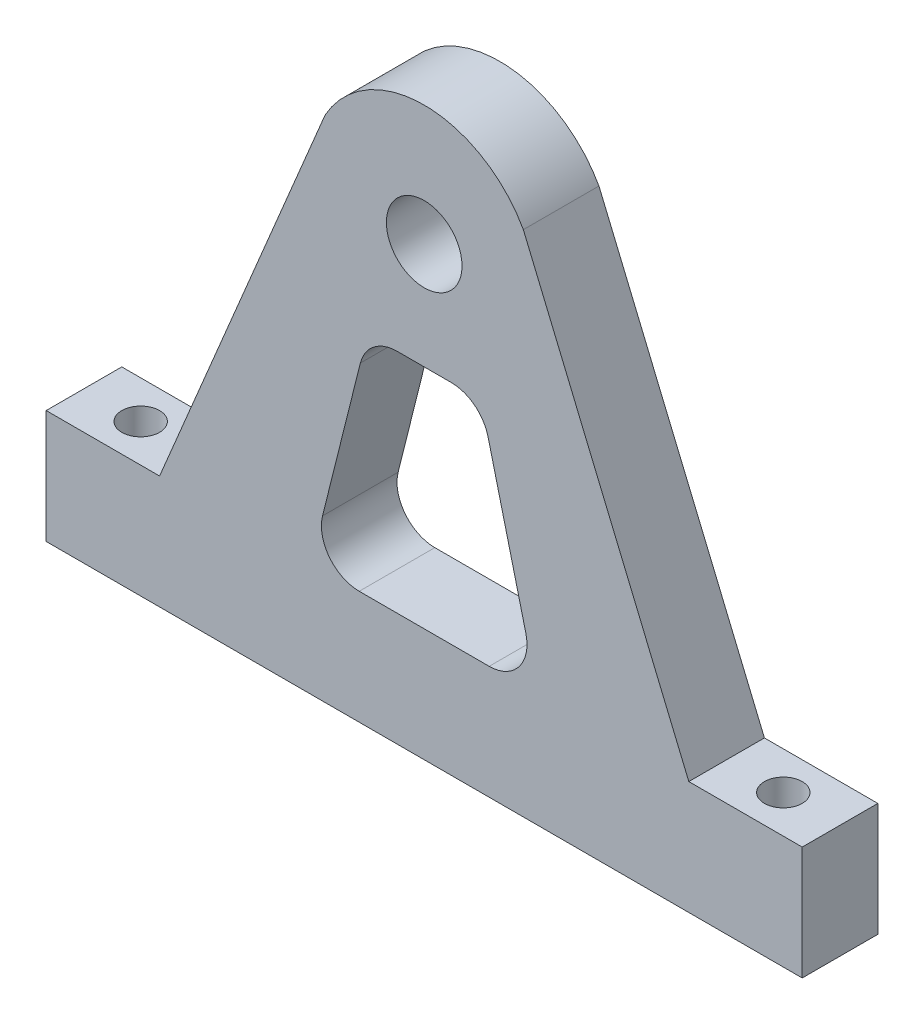
ISO-10303-21;
HEADER;
FILE_DESCRIPTION(('STEP AP214'),'2;1');
FILE_NAME('part.step','',(''),(''),'','','');
FILE_SCHEMA(('AUTOMOTIVE_DESIGN { 1 0 10303 214 1 1 1 1 }'));
ENDSEC;
DATA;
#1=APPLICATION_CONTEXT('core data for automotive mechanical design processes');
#2=APPLICATION_PROTOCOL_DEFINITION('international standard','automotive_design',2000,#1);
#3=PRODUCT_CONTEXT('',#1,'mechanical');
#4=PRODUCT('Part','Part','',(#3));
#5=PRODUCT_RELATED_PRODUCT_CATEGORY('part','',(#4));
#6=PRODUCT_DEFINITION_FORMATION('','',#4);
#7=PRODUCT_DEFINITION_CONTEXT('part definition',#1,'design');
#8=PRODUCT_DEFINITION('design','',#6,#7);
#9=PRODUCT_DEFINITION_SHAPE('','',#8);
#10=(LENGTH_UNIT() NAMED_UNIT(*) SI_UNIT(.MILLI.,.METRE.));
#11=(NAMED_UNIT(*) PLANE_ANGLE_UNIT() SI_UNIT($,.RADIAN.));
#12=(NAMED_UNIT(*) SI_UNIT($,.STERADIAN.) SOLID_ANGLE_UNIT());
#13=UNCERTAINTY_MEASURE_WITH_UNIT(LENGTH_MEASURE(1.E-05),#10,'distance_accuracy_value','');
#14=(GEOMETRIC_REPRESENTATION_CONTEXT(3) GLOBAL_UNCERTAINTY_ASSIGNED_CONTEXT((#13)) GLOBAL_UNIT_ASSIGNED_CONTEXT((#10,
#11,#12)) REPRESENTATION_CONTEXT('',''));
#15=CARTESIAN_POINT('',(0.,0.,0.));
#16=DIRECTION('',(0.,0.,1.));
#17=DIRECTION('',(1.,0.,0.));
#18=AXIS2_PLACEMENT_3D('',#15,#16,#17);
#19=CARTESIAN_POINT('',(0.,60.,10.));
#20=DIRECTION('',(0.,0.,1.));
#21=DIRECTION('',(1.,0.,0.));
#22=AXIS2_PLACEMENT_3D('',#19,#20,#21);
#23=PLANE('',#22);
#24=DIRECTION('',(1.,0.,0.));
#25=VECTOR('',#24,1.);
#26=CARTESIAN_POINT('',(0.,15.,10.));
#27=LINE('',#26,#25);
#28=CARTESIAN_POINT('',(-8.59611796797788,15.,10.));
#29=VERTEX_POINT('',#28);
#30=CARTESIAN_POINT('',(8.59611796797788,15.,10.));
#31=VERTEX_POINT('',#30);
#32=EDGE_CURVE('E212',#29,#31,#27,.T.);
#33=ORIENTED_EDGE('',*,*,#32,.F.);
#34=CARTESIAN_POINT('',(-8.59611796797792,20.,10.));
#35=DIRECTION('',(0.,0.,1.));
#36=DIRECTION('',(1.,0.,0.));
#37=AXIS2_PLACEMENT_3D('',#34,#35,#36);
#38=CIRCLE('',#37,5.);
#39=CARTESIAN_POINT('',(-13.4468304687046,21.2126781251817,10.));
#40=VERTEX_POINT('',#39);
#41=EDGE_CURVE('E189',#40,#29,#38,.T.);
#42=ORIENTED_EDGE('',*,*,#41,.F.);
#43=DIRECTION('',(-0.242535625036333,-0.970142500145332,0.));
#44=VECTOR('',#43,1.);
#45=CARTESIAN_POINT('',(-3.52941176470588,60.8823529411765,10.));
#46=LINE('',#45,#44);
#47=CARTESIAN_POINT('',(-8.44683046870459,41.2126781251816,10.));
#48=VERTEX_POINT('',#47);
#49=EDGE_CURVE('E154',#48,#40,#46,.T.);
#50=ORIENTED_EDGE('',*,*,#49,.F.);
#51=CARTESIAN_POINT('',(-3.59611796797792,40.,10.));
#52=DIRECTION('',(0.,0.,1.));
#53=DIRECTION('',(1.,0.,0.));
#54=AXIS2_PLACEMENT_3D('',#51,#52,#53);
#55=CIRCLE('',#54,5.);
#56=CARTESIAN_POINT('',(-3.5961179679779,45.,10.));
#57=VERTEX_POINT('',#56);
#58=EDGE_CURVE('E202',#57,#48,#55,.T.);
#59=ORIENTED_EDGE('',*,*,#58,.F.);
#60=DIRECTION('',(-1.,0.,0.));
#61=VECTOR('',#60,1.);
#62=CARTESIAN_POINT('',(0.,45.,10.));
#63=LINE('',#62,#61);
#64=CARTESIAN_POINT('',(3.5961179679779,45.,10.));
#65=VERTEX_POINT('',#64);
#66=EDGE_CURVE('E204',#65,#57,#63,.T.);
#67=ORIENTED_EDGE('',*,*,#66,.F.);
#68=CARTESIAN_POINT('',(3.59611796797792,40.,10.));
#69=DIRECTION('',(0.,0.,1.));
#70=DIRECTION('',(1.,0.,0.));
#71=AXIS2_PLACEMENT_3D('',#68,#69,#70);
#72=CIRCLE('',#71,5.);
#73=CARTESIAN_POINT('',(8.44683046870459,41.2126781251816,10.));
#74=VERTEX_POINT('',#73);
#75=EDGE_CURVE('E206',#74,#65,#72,.T.);
#76=ORIENTED_EDGE('',*,*,#75,.F.);
#77=DIRECTION('',(-0.242535625036333,0.970142500145332,0.));
#78=VECTOR('',#77,1.);
#79=CARTESIAN_POINT('',(3.52941176470588,60.8823529411765,10.));
#80=LINE('',#79,#78);
#81=CARTESIAN_POINT('',(13.4468304687046,21.2126781251817,10.));
#82=VERTEX_POINT('',#81);
#83=EDGE_CURVE('E208',#82,#74,#80,.T.);
#84=ORIENTED_EDGE('',*,*,#83,.F.);
#85=CARTESIAN_POINT('',(8.59611796797792,20.,10.));
#86=DIRECTION('',(0.,0.,1.));
#87=DIRECTION('',(1.,0.,0.));
#88=AXIS2_PLACEMENT_3D('',#85,#86,#87);
#89=CIRCLE('',#88,5.);
#90=EDGE_CURVE('E210',#31,#82,#89,.T.);
#91=ORIENTED_EDGE('',*,*,#90,.F.);
#92=EDGE_LOOP('',(#33,#42,#50,#59,#67,#76,#84,#91));
#93=FACE_BOUND('',#92,.T.);
#94=DIRECTION('',(-1.,0.,0.));
#95=VECTOR('',#94,1.);
#96=CARTESIAN_POINT('',(50.0000000000001,15.,10.));
#97=LINE('',#96,#95);
#98=CARTESIAN_POINT('',(50.0000000000001,15.,10.));
#99=VERTEX_POINT('',#98);
#100=CARTESIAN_POINT('',(35.0000000000001,15.,10.));
#101=VERTEX_POINT('',#100);
#102=EDGE_CURVE('E221',#99,#101,#97,.T.);
#103=ORIENTED_EDGE('',*,*,#102,.T.);
#104=DIRECTION('',(-0.386144072882083,0.922438483031815,0.));
#105=VECTOR('',#104,1.);
#106=CARTESIAN_POINT('',(35.0000000000001,15.,10.));
#107=LINE('',#106,#105);
#108=CARTESIAN_POINT('',(13.1149875109068,67.2799108915398,10.));
#109=VERTEX_POINT('',#108);
#110=EDGE_CURVE('E224',#101,#109,#107,.T.);
#111=ORIENTED_EDGE('',*,*,#110,.T.);
#112=CARTESIAN_POINT('',(0.,60.,10.));
#113=DIRECTION('',(0.,0.,1.));
#114=DIRECTION('',(1.,0.,0.));
#115=AXIS2_PLACEMENT_3D('',#112,#113,#114);
#116=CIRCLE('',#115,15.);
#117=CARTESIAN_POINT('',(-13.1149875109068,67.2799108915398,10.));
#118=VERTEX_POINT('',#117);
#119=EDGE_CURVE('E227',#109,#118,#116,.T.);
#120=ORIENTED_EDGE('',*,*,#119,.T.);
#121=DIRECTION('',(-0.386144072882083,-0.922438483031815,0.));
#122=VECTOR('',#121,1.);
#123=CARTESIAN_POINT('',(-35.0000000000001,15.,10.));
#124=LINE('',#123,#122);
#125=CARTESIAN_POINT('',(-35.0000000000001,15.,10.));
#126=VERTEX_POINT('',#125);
#127=EDGE_CURVE('E229',#118,#126,#124,.T.);
#128=ORIENTED_EDGE('',*,*,#127,.T.);
#129=DIRECTION('',(-1.,0.,0.));
#130=VECTOR('',#129,1.);
#131=CARTESIAN_POINT('',(-50.0000000000001,15.,10.));
#132=LINE('',#131,#130);
#133=CARTESIAN_POINT('',(-50.0000000000001,15.,10.));
#134=VERTEX_POINT('',#133);
#135=EDGE_CURVE('E231',#126,#134,#132,.T.);
#136=ORIENTED_EDGE('',*,*,#135,.T.);
#137=DIRECTION('',(0.,-1.,0.));
#138=VECTOR('',#137,1.);
#139=CARTESIAN_POINT('',(-50.0000000000001,0.,10.));
#140=LINE('',#139,#138);
#141=CARTESIAN_POINT('',(-50.0000000000001,0.,10.));
#142=VERTEX_POINT('',#141);
#143=EDGE_CURVE('E233',#134,#142,#140,.T.);
#144=ORIENTED_EDGE('',*,*,#143,.T.);
#145=DIRECTION('',(1.,0.,0.));
#146=VECTOR('',#145,1.);
#147=CARTESIAN_POINT('',(-35.,0.,10.));
#148=LINE('',#147,#146);
#149=CARTESIAN_POINT('',(50.0000000000001,0.,10.));
#150=VERTEX_POINT('',#149);
#151=EDGE_CURVE('E235',#142,#150,#148,.T.);
#152=ORIENTED_EDGE('',*,*,#151,.T.);
#153=DIRECTION('',(0.,1.,0.));
#154=VECTOR('',#153,1.);
#155=CARTESIAN_POINT('',(50.0000000000001,0.,10.));
#156=LINE('',#155,#154);
#157=EDGE_CURVE('E237',#150,#99,#156,.T.);
#158=ORIENTED_EDGE('',*,*,#157,.T.);
#159=EDGE_LOOP('',(#103,#111,#120,#128,#136,#144,#152,#158));
#160=FACE_BOUND('',#159,.T.);
#161=CARTESIAN_POINT('',(0.,59.06,10.));
#162=DIRECTION('',(0.,0.,1.));
#163=DIRECTION('',(1.,0.,0.));
#164=AXIS2_PLACEMENT_3D('',#161,#162,#163);
#165=CIRCLE('',#164,5.);
#166=CARTESIAN_POINT('',(5.,59.06,10.));
#167=VERTEX_POINT('',#166);
#168=EDGE_CURVE('E215',#167,#167,#165,.T.);
#169=ORIENTED_EDGE('',*,*,#168,.F.);
#170=EDGE_LOOP('',(#169));
#171=FACE_BOUND('',#170,.T.);
#172=ADVANCED_FACE('F33',(#93,#160,#171),#23,.T.);
#173=CARTESIAN_POINT('',(0.,60.,0.));
#174=DIRECTION('',(0.,0.,1.));
#175=DIRECTION('',(1.,0.,0.));
#176=AXIS2_PLACEMENT_3D('',#173,#174,#175);
#177=PLANE('',#176);
#178=CARTESIAN_POINT('',(-8.59611796797792,20.,0.));
#179=DIRECTION('',(0.,0.,-1.));
#180=DIRECTION('',(-1.,0.,0.));
#181=AXIS2_PLACEMENT_3D('',#178,#179,#180);
#182=CIRCLE('',#181,5.);
#183=CARTESIAN_POINT('',(-8.59611796797788,15.,0.));
#184=VERTEX_POINT('',#183);
#185=CARTESIAN_POINT('',(-13.4468304687046,21.2126781251817,0.));
#186=VERTEX_POINT('',#185);
#187=EDGE_CURVE('E160',#184,#186,#182,.T.);
#188=ORIENTED_EDGE('',*,*,#187,.F.);
#189=DIRECTION('',(-1.,0.,0.));
#190=VECTOR('',#189,1.);
#191=CARTESIAN_POINT('',(0.,15.,0.));
#192=LINE('',#191,#190);
#193=CARTESIAN_POINT('',(8.59611796797788,15.,0.));
#194=VERTEX_POINT('',#193);
#195=EDGE_CURVE('E58',#194,#184,#192,.T.);
#196=ORIENTED_EDGE('',*,*,#195,.F.);
#197=CARTESIAN_POINT('',(8.59611796797792,20.,0.));
#198=DIRECTION('',(0.,0.,-1.));
#199=DIRECTION('',(-1.,0.,0.));
#200=AXIS2_PLACEMENT_3D('',#197,#198,#199);
#201=CIRCLE('',#200,5.);
#202=CARTESIAN_POINT('',(13.4468304687046,21.2126781251817,0.));
#203=VERTEX_POINT('',#202);
#204=EDGE_CURVE('E183',#203,#194,#201,.T.);
#205=ORIENTED_EDGE('',*,*,#204,.F.);
#206=DIRECTION('',(0.242535625036333,-0.970142500145332,0.));
#207=VECTOR('',#206,1.);
#208=CARTESIAN_POINT('',(8.44683046870459,41.2126781251816,0.));
#209=LINE('',#208,#207);
#210=CARTESIAN_POINT('',(8.44683046870459,41.2126781251816,0.));
#211=VERTEX_POINT('',#210);
#212=EDGE_CURVE('E180',#211,#203,#209,.T.);
#213=ORIENTED_EDGE('',*,*,#212,.F.);
#214=CARTESIAN_POINT('',(3.59611796797792,40.,0.));
#215=DIRECTION('',(0.,0.,-1.));
#216=DIRECTION('',(-1.,0.,0.));
#217=AXIS2_PLACEMENT_3D('',#214,#215,#216);
#218=CIRCLE('',#217,5.);
#219=CARTESIAN_POINT('',(3.5961179679779,45.,0.));
#220=VERTEX_POINT('',#219);
#221=EDGE_CURVE('E177',#220,#211,#218,.T.);
#222=ORIENTED_EDGE('',*,*,#221,.F.);
#223=DIRECTION('',(1.,0.,0.));
#224=VECTOR('',#223,1.);
#225=CARTESIAN_POINT('',(0.,45.,0.));
#226=LINE('',#225,#224);
#227=CARTESIAN_POINT('',(-3.5961179679779,45.,0.));
#228=VERTEX_POINT('',#227);
#229=EDGE_CURVE('E171',#228,#220,#226,.T.);
#230=ORIENTED_EDGE('',*,*,#229,.F.);
#231=CARTESIAN_POINT('',(-3.59611796797792,40.,0.));
#232=DIRECTION('',(0.,0.,-1.));
#233=DIRECTION('',(-1.,0.,0.));
#234=AXIS2_PLACEMENT_3D('',#231,#232,#233);
#235=CIRCLE('',#234,5.);
#236=CARTESIAN_POINT('',(-8.44683046870459,41.2126781251816,0.));
#237=VERTEX_POINT('',#236);
#238=EDGE_CURVE('E169',#237,#228,#235,.T.);
#239=ORIENTED_EDGE('',*,*,#238,.F.);
#240=DIRECTION('',(0.242535625036333,0.970142500145332,0.));
#241=VECTOR('',#240,1.);
#242=CARTESIAN_POINT('',(-13.4468304687046,21.2126781251817,0.));
#243=LINE('',#242,#241);
#244=EDGE_CURVE('E151',#186,#237,#243,.T.);
#245=ORIENTED_EDGE('',*,*,#244,.F.);
#246=EDGE_LOOP('',(#188,#196,#205,#213,#222,#230,#239,#245));
#247=FACE_BOUND('',#246,.T.);
#248=DIRECTION('',(-1.,0.,0.));
#249=VECTOR('',#248,1.);
#250=CARTESIAN_POINT('',(50.0000000000001,15.,0.));
#251=LINE('',#250,#249);
#252=CARTESIAN_POINT('',(50.0000000000001,15.,0.));
#253=VERTEX_POINT('',#252);
#254=CARTESIAN_POINT('',(35.0000000000001,15.,0.));
#255=VERTEX_POINT('',#254);
#256=EDGE_CURVE('E218',#253,#255,#251,.T.);
#257=ORIENTED_EDGE('',*,*,#256,.F.);
#258=DIRECTION('',(0.,1.,0.));
#259=VECTOR('',#258,1.);
#260=CARTESIAN_POINT('',(50.0000000000001,0.,0.));
#261=LINE('',#260,#259);
#262=CARTESIAN_POINT('',(50.0000000000001,0.,0.));
#263=VERTEX_POINT('',#262);
#264=EDGE_CURVE('E225',#263,#253,#261,.T.);
#265=ORIENTED_EDGE('',*,*,#264,.F.);
#266=DIRECTION('',(1.,0.,0.));
#267=VECTOR('',#266,1.);
#268=CARTESIAN_POINT('',(35.,0.,0.));
#269=LINE('',#268,#267);
#270=CARTESIAN_POINT('',(-50.0000000000001,0.,0.));
#271=VERTEX_POINT('',#270);
#272=EDGE_CURVE('E253',#271,#263,#269,.T.);
#273=ORIENTED_EDGE('',*,*,#272,.F.);
#274=DIRECTION('',(0.,-1.,0.));
#275=VECTOR('',#274,1.);
#276=CARTESIAN_POINT('',(-50.0000000000001,0.,0.));
#277=LINE('',#276,#275);
#278=CARTESIAN_POINT('',(-50.0000000000001,15.,0.));
#279=VERTEX_POINT('',#278);
#280=EDGE_CURVE('E250',#279,#271,#277,.T.);
#281=ORIENTED_EDGE('',*,*,#280,.F.);
#282=DIRECTION('',(-1.,0.,0.));
#283=VECTOR('',#282,1.);
#284=CARTESIAN_POINT('',(-50.0000000000001,15.,0.));
#285=LINE('',#284,#283);
#286=CARTESIAN_POINT('',(-35.0000000000001,15.,0.));
#287=VERTEX_POINT('',#286);
#288=EDGE_CURVE('E248',#287,#279,#285,.T.);
#289=ORIENTED_EDGE('',*,*,#288,.F.);
#290=DIRECTION('',(-0.386144072882083,-0.922438483031815,0.));
#291=VECTOR('',#290,1.);
#292=CARTESIAN_POINT('',(-35.0000000000001,15.,0.));
#293=LINE('',#292,#291);
#294=CARTESIAN_POINT('',(-13.1149875109068,67.2799108915398,0.));
#295=VERTEX_POINT('',#294);
#296=EDGE_CURVE('E246',#295,#287,#293,.T.);
#297=ORIENTED_EDGE('',*,*,#296,.F.);
#298=CARTESIAN_POINT('',(0.,60.,0.));
#299=DIRECTION('',(0.,0.,1.));
#300=DIRECTION('',(1.,0.,0.));
#301=AXIS2_PLACEMENT_3D('',#298,#299,#300);
#302=CIRCLE('',#301,15.);
#303=CARTESIAN_POINT('',(13.1149875109068,67.2799108915398,0.));
#304=VERTEX_POINT('',#303);
#305=EDGE_CURVE('E244',#304,#295,#302,.T.);
#306=ORIENTED_EDGE('',*,*,#305,.F.);
#307=DIRECTION('',(-0.386144072882083,0.922438483031815,0.));
#308=VECTOR('',#307,1.);
#309=CARTESIAN_POINT('',(35.0000000000001,15.,0.));
#310=LINE('',#309,#308);
#311=EDGE_CURVE('E242',#255,#304,#310,.T.);
#312=ORIENTED_EDGE('',*,*,#311,.F.);
#313=EDGE_LOOP('',(#257,#265,#273,#281,#289,#297,#306,#312));
#314=FACE_BOUND('',#313,.T.);
#315=CARTESIAN_POINT('',(0.,59.06,0.));
#316=DIRECTION('',(0.,0.,1.));
#317=DIRECTION('',(1.,0.,0.));
#318=AXIS2_PLACEMENT_3D('',#315,#316,#317);
#319=CIRCLE('',#318,5.);
#320=CARTESIAN_POINT('',(5.,59.06,0.));
#321=VERTEX_POINT('',#320);
#322=EDGE_CURVE('E214',#321,#321,#319,.T.);
#323=ORIENTED_EDGE('',*,*,#322,.T.);
#324=EDGE_LOOP('',(#323));
#325=FACE_BOUND('',#324,.T.);
#326=ADVANCED_FACE('F165',(#247,#314,#325),#177,.F.);
#327=CARTESIAN_POINT('',(50.0000000000001,15.,10.));
#328=DIRECTION('',(0.,-1.,0.));
#329=DIRECTION('',(0.,0.,-1.));
#330=AXIS2_PLACEMENT_3D('',#327,#328,#329);
#331=PLANE('',#330);
#332=CARTESIAN_POINT('',(42.5000000000001,15.,5.));
#333=DIRECTION('',(0.,1.,0.));
#334=DIRECTION('',(0.,0.,-1.));
#335=AXIS2_PLACEMENT_3D('',#332,#333,#334);
#336=CIRCLE('',#335,2.5);
#337=CARTESIAN_POINT('',(42.5000000000001,15.,2.5));
#338=VERTEX_POINT('',#337);
#339=EDGE_CURVE('E282',#338,#338,#336,.T.);
#340=ORIENTED_EDGE('',*,*,#339,.F.);
#341=EDGE_LOOP('',(#340));
#342=FACE_BOUND('',#341,.T.);
#343=ORIENTED_EDGE('',*,*,#256,.T.);
#344=DIRECTION('',(0.,0.,-1.));
#345=VECTOR('',#344,1.);
#346=CARTESIAN_POINT('',(35.0000000000001,15.,10.));
#347=LINE('',#346,#345);
#348=EDGE_CURVE('E11',#101,#255,#347,.T.);
#349=ORIENTED_EDGE('',*,*,#348,.F.);
#350=ORIENTED_EDGE('',*,*,#102,.F.);
#351=DIRECTION('',(0.,0.,-1.));
#352=VECTOR('',#351,1.);
#353=CARTESIAN_POINT('',(50.0000000000001,15.,10.));
#354=LINE('',#353,#352);
#355=EDGE_CURVE('E239',#99,#253,#354,.T.);
#356=ORIENTED_EDGE('',*,*,#355,.T.);
#357=EDGE_LOOP('',(#343,#349,#350,#356));
#358=FACE_BOUND('',#357,.T.);
#359=ADVANCED_FACE('F35',(#342,#358),#331,.F.);
#360=CARTESIAN_POINT('',(35.0000000000001,15.,10.));
#361=DIRECTION('',(-0.922438483031815,-0.386144072882083,0.));
#362=DIRECTION('',(0.386144072882083,-0.922438483031815,0.));
#363=AXIS2_PLACEMENT_3D('',#360,#361,#362);
#364=PLANE('',#363);
#365=ORIENTED_EDGE('',*,*,#311,.T.);
#366=DIRECTION('',(0.,0.,-1.));
#367=VECTOR('',#366,1.);
#368=CARTESIAN_POINT('',(13.1149875109068,67.2799108915398,10.));
#369=LINE('',#368,#367);
#370=EDGE_CURVE('E42',#109,#304,#369,.T.);
#371=ORIENTED_EDGE('',*,*,#370,.F.);
#372=ORIENTED_EDGE('',*,*,#110,.F.);
#373=ORIENTED_EDGE('',*,*,#348,.T.);
#374=EDGE_LOOP('',(#365,#371,#372,#373));
#375=FACE_BOUND('',#374,.T.);
#376=ADVANCED_FACE('F292',(#375),#364,.F.);
#377=CARTESIAN_POINT('',(0.,60.,10.));
#378=DIRECTION('',(0.,0.,-1.));
#379=DIRECTION('',(-1.,0.,0.));
#380=AXIS2_PLACEMENT_3D('',#377,#378,#379);
#381=CYLINDRICAL_SURFACE('',#380,15.);
#382=ORIENTED_EDGE('',*,*,#305,.T.);
#383=DIRECTION('',(0.,0.,-1.));
#384=VECTOR('',#383,1.);
#385=CARTESIAN_POINT('',(-13.1149875109068,67.2799108915398,10.));
#386=LINE('',#385,#384);
#387=EDGE_CURVE('E270',#118,#295,#386,.T.);
#388=ORIENTED_EDGE('',*,*,#387,.F.);
#389=ORIENTED_EDGE('',*,*,#119,.F.);
#390=ORIENTED_EDGE('',*,*,#370,.T.);
#391=EDGE_LOOP('',(#382,#388,#389,#390));
#392=FACE_BOUND('',#391,.T.);
#393=ADVANCED_FACE('F329',(#392),#381,.T.);
#394=CARTESIAN_POINT('',(-35.0000000000001,15.,10.));
#395=DIRECTION('',(0.922438483031815,-0.386144072882083,0.));
#396=DIRECTION('',(0.386144072882083,0.922438483031815,0.));
#397=AXIS2_PLACEMENT_3D('',#394,#395,#396);
#398=PLANE('',#397);
#399=ORIENTED_EDGE('',*,*,#296,.T.);
#400=DIRECTION('',(0.,0.,-1.));
#401=VECTOR('',#400,1.);
#402=CARTESIAN_POINT('',(-35.0000000000001,15.,10.));
#403=LINE('',#402,#401);
#404=EDGE_CURVE('E267',#126,#287,#403,.T.);
#405=ORIENTED_EDGE('',*,*,#404,.F.);
#406=ORIENTED_EDGE('',*,*,#127,.F.);
#407=ORIENTED_EDGE('',*,*,#387,.T.);
#408=EDGE_LOOP('',(#399,#405,#406,#407));
#409=FACE_BOUND('',#408,.T.);
#410=ADVANCED_FACE('F325',(#409),#398,.F.);
#411=CARTESIAN_POINT('',(-50.0000000000001,15.,10.));
#412=DIRECTION('',(0.,-1.,0.));
#413=DIRECTION('',(0.,0.,-1.));
#414=AXIS2_PLACEMENT_3D('',#411,#412,#413);
#415=PLANE('',#414);
#416=CARTESIAN_POINT('',(-42.5000000000001,15.,5.));
#417=DIRECTION('',(0.,1.,0.));
#418=DIRECTION('',(0.,0.,1.));
#419=AXIS2_PLACEMENT_3D('',#416,#417,#418);
#420=CIRCLE('',#419,2.5);
#421=CARTESIAN_POINT('',(-42.5000000000001,15.,7.5));
#422=VERTEX_POINT('',#421);
#423=EDGE_CURVE('E275',#422,#422,#420,.T.);
#424=ORIENTED_EDGE('',*,*,#423,.F.);
#425=EDGE_LOOP('',(#424));
#426=FACE_BOUND('',#425,.T.);
#427=ORIENTED_EDGE('',*,*,#288,.T.);
#428=DIRECTION('',(0.,0.,-1.));
#429=VECTOR('',#428,1.);
#430=CARTESIAN_POINT('',(-50.0000000000001,15.,10.));
#431=LINE('',#430,#429);
#432=EDGE_CURVE('E264',#134,#279,#431,.T.);
#433=ORIENTED_EDGE('',*,*,#432,.F.);
#434=ORIENTED_EDGE('',*,*,#135,.F.);
#435=ORIENTED_EDGE('',*,*,#404,.T.);
#436=EDGE_LOOP('',(#427,#433,#434,#435));
#437=FACE_BOUND('',#436,.T.);
#438=ADVANCED_FACE('F322',(#426,#437),#415,.F.);
#439=CARTESIAN_POINT('',(-50.0000000000001,0.,10.));
#440=DIRECTION('',(1.,0.,0.));
#441=DIRECTION('',(0.,0.,-1.));
#442=AXIS2_PLACEMENT_3D('',#439,#440,#441);
#443=PLANE('',#442);
#444=ORIENTED_EDGE('',*,*,#280,.T.);
#445=DIRECTION('',(0.,0.,-1.));
#446=VECTOR('',#445,1.);
#447=CARTESIAN_POINT('',(-50.0000000000001,0.,10.));
#448=LINE('',#447,#446);
#449=EDGE_CURVE('E261',#142,#271,#448,.T.);
#450=ORIENTED_EDGE('',*,*,#449,.F.);
#451=ORIENTED_EDGE('',*,*,#143,.F.);
#452=ORIENTED_EDGE('',*,*,#432,.T.);
#453=EDGE_LOOP('',(#444,#450,#451,#452));
#454=FACE_BOUND('',#453,.T.);
#455=ADVANCED_FACE('F317',(#454),#443,.F.);
#456=CARTESIAN_POINT('',(35.,0.,10.));
#457=DIRECTION('',(0.,1.,0.));
#458=DIRECTION('',(-1.,0.,0.));
#459=AXIS2_PLACEMENT_3D('',#456,#457,#458);
#460=PLANE('',#459);
#461=CARTESIAN_POINT('',(42.5000000000001,0.,5.));
#462=DIRECTION('',(0.,1.,0.));
#463=DIRECTION('',(-1.,0.,0.));
#464=AXIS2_PLACEMENT_3D('',#461,#462,#463);
#465=CIRCLE('',#464,2.5);
#466=CARTESIAN_POINT('',(40.0000000000001,0.,5.));
#467=VERTEX_POINT('',#466);
#468=EDGE_CURVE('E37',#467,#467,#465,.T.);
#469=ORIENTED_EDGE('',*,*,#468,.T.);
#470=EDGE_LOOP('',(#469));
#471=FACE_BOUND('',#470,.T.);
#472=CARTESIAN_POINT('',(-42.5000000000001,0.,5.));
#473=DIRECTION('',(0.,1.,0.));
#474=DIRECTION('',(-1.,0.,0.));
#475=AXIS2_PLACEMENT_3D('',#472,#473,#474);
#476=CIRCLE('',#475,2.5);
#477=CARTESIAN_POINT('',(-45.0000000000001,0.,5.));
#478=VERTEX_POINT('',#477);
#479=EDGE_CURVE('E163',#478,#478,#476,.T.);
#480=ORIENTED_EDGE('',*,*,#479,.T.);
#481=EDGE_LOOP('',(#480));
#482=FACE_BOUND('',#481,.T.);
#483=ORIENTED_EDGE('',*,*,#272,.T.);
#484=DIRECTION('',(0.,0.,-1.));
#485=VECTOR('',#484,1.);
#486=CARTESIAN_POINT('',(50.0000000000001,0.,10.));
#487=LINE('',#486,#485);
#488=EDGE_CURVE('E258',#150,#263,#487,.T.);
#489=ORIENTED_EDGE('',*,*,#488,.F.);
#490=ORIENTED_EDGE('',*,*,#151,.F.);
#491=ORIENTED_EDGE('',*,*,#449,.T.);
#492=EDGE_LOOP('',(#483,#489,#490,#491));
#493=FACE_BOUND('',#492,.T.);
#494=ADVANCED_FACE('F312',(#471,#482,#493),#460,.F.);
#495=CARTESIAN_POINT('',(50.0000000000001,0.,10.));
#496=DIRECTION('',(-1.,0.,0.));
#497=DIRECTION('',(0.,0.,1.));
#498=AXIS2_PLACEMENT_3D('',#495,#496,#497);
#499=PLANE('',#498);
#500=ORIENTED_EDGE('',*,*,#264,.T.);
#501=ORIENTED_EDGE('',*,*,#355,.F.);
#502=ORIENTED_EDGE('',*,*,#157,.F.);
#503=ORIENTED_EDGE('',*,*,#488,.T.);
#504=EDGE_LOOP('',(#500,#501,#502,#503));
#505=FACE_BOUND('',#504,.T.);
#506=ADVANCED_FACE('F310',(#505),#499,.F.);
#507=CARTESIAN_POINT('',(0.,59.06,10.));
#508=DIRECTION('',(0.,0.,-1.));
#509=DIRECTION('',(-1.,0.,0.));
#510=AXIS2_PLACEMENT_3D('',#507,#508,#509);
#511=CYLINDRICAL_SURFACE('',#510,5.);
#512=ORIENTED_EDGE('',*,*,#168,.T.);
#513=EDGE_LOOP('',(#512));
#514=FACE_BOUND('',#513,.T.);
#515=ORIENTED_EDGE('',*,*,#322,.F.);
#516=EDGE_LOOP('',(#515));
#517=FACE_BOUND('',#516,.T.);
#518=ADVANCED_FACE('F346',(#514,#517),#511,.F.);
#519=CARTESIAN_POINT('',(0.,15.,25.));
#520=DIRECTION('',(0.,-1.,0.));
#521=DIRECTION('',(1.,0.,0.));
#522=AXIS2_PLACEMENT_3D('',#519,#520,#521);
#523=PLANE('',#522);
#524=ORIENTED_EDGE('',*,*,#32,.T.);
#525=DIRECTION('',(0.,0.,-1.));
#526=VECTOR('',#525,1.);
#527=CARTESIAN_POINT('',(8.59611796797788,15.,25.));
#528=LINE('',#527,#526);
#529=EDGE_CURVE('E187',#31,#194,#528,.T.);
#530=ORIENTED_EDGE('',*,*,#529,.T.);
#531=ORIENTED_EDGE('',*,*,#195,.T.);
#532=DIRECTION('',(0.,0.,-1.));
#533=VECTOR('',#532,1.);
#534=CARTESIAN_POINT('',(-8.59611796797788,15.,25.));
#535=LINE('',#534,#533);
#536=EDGE_CURVE('E157',#29,#184,#535,.T.);
#537=ORIENTED_EDGE('',*,*,#536,.F.);
#538=EDGE_LOOP('',(#524,#530,#531,#537));
#539=FACE_BOUND('',#538,.T.);
#540=ADVANCED_FACE('F389',(#539),#523,.F.);
#541=CARTESIAN_POINT('',(8.59611796797792,20.,25.));
#542=DIRECTION('',(0.,0.,-1.));
#543=DIRECTION('',(-1.,0.,0.));
#544=AXIS2_PLACEMENT_3D('',#541,#542,#543);
#545=CYLINDRICAL_SURFACE('',#544,5.);
#546=ORIENTED_EDGE('',*,*,#90,.T.);
#547=DIRECTION('',(0.,0.,-1.));
#548=VECTOR('',#547,1.);
#549=CARTESIAN_POINT('',(13.4468304687046,21.2126781251817,25.));
#550=LINE('',#549,#548);
#551=EDGE_CURVE('E190',#82,#203,#550,.T.);
#552=ORIENTED_EDGE('',*,*,#551,.T.);
#553=ORIENTED_EDGE('',*,*,#204,.T.);
#554=ORIENTED_EDGE('',*,*,#529,.F.);
#555=EDGE_LOOP('',(#546,#552,#553,#554));
#556=FACE_BOUND('',#555,.T.);
#557=ADVANCED_FACE('F392',(#556),#545,.F.);
#558=CARTESIAN_POINT('',(8.44683046870459,41.2126781251816,25.));
#559=DIRECTION('',(0.970142500145332,0.242535625036333,0.));
#560=DIRECTION('',(-0.242535625036333,0.970142500145332,0.));
#561=AXIS2_PLACEMENT_3D('',#558,#559,#560);
#562=PLANE('',#561);
#563=ORIENTED_EDGE('',*,*,#83,.T.);
#564=DIRECTION('',(0.,0.,-1.));
#565=VECTOR('',#564,1.);
#566=CARTESIAN_POINT('',(8.44683046870459,41.2126781251816,25.));
#567=LINE('',#566,#565);
#568=EDGE_CURVE('E192',#74,#211,#567,.T.);
#569=ORIENTED_EDGE('',*,*,#568,.T.);
#570=ORIENTED_EDGE('',*,*,#212,.T.);
#571=ORIENTED_EDGE('',*,*,#551,.F.);
#572=EDGE_LOOP('',(#563,#569,#570,#571));
#573=FACE_BOUND('',#572,.T.);
#574=ADVANCED_FACE('F395',(#573),#562,.F.);
#575=CARTESIAN_POINT('',(3.59611796797792,40.,25.));
#576=DIRECTION('',(0.,0.,-1.));
#577=DIRECTION('',(-1.,0.,0.));
#578=AXIS2_PLACEMENT_3D('',#575,#576,#577);
#579=CYLINDRICAL_SURFACE('',#578,5.);
#580=ORIENTED_EDGE('',*,*,#75,.T.);
#581=DIRECTION('',(0.,0.,-1.));
#582=VECTOR('',#581,1.);
#583=CARTESIAN_POINT('',(3.5961179679779,45.,25.));
#584=LINE('',#583,#582);
#585=EDGE_CURVE('E194',#65,#220,#584,.T.);
#586=ORIENTED_EDGE('',*,*,#585,.T.);
#587=ORIENTED_EDGE('',*,*,#221,.T.);
#588=ORIENTED_EDGE('',*,*,#568,.F.);
#589=EDGE_LOOP('',(#580,#586,#587,#588));
#590=FACE_BOUND('',#589,.T.);
#591=ADVANCED_FACE('F399',(#590),#579,.F.);
#592=CARTESIAN_POINT('',(0.,45.,25.));
#593=DIRECTION('',(0.,1.,0.));
#594=DIRECTION('',(0.,0.,1.));
#595=AXIS2_PLACEMENT_3D('',#592,#593,#594);
#596=PLANE('',#595);
#597=ORIENTED_EDGE('',*,*,#66,.T.);
#598=DIRECTION('',(0.,0.,-1.));
#599=VECTOR('',#598,1.);
#600=CARTESIAN_POINT('',(-3.5961179679779,45.,25.));
#601=LINE('',#600,#599);
#602=EDGE_CURVE('E196',#57,#228,#601,.T.);
#603=ORIENTED_EDGE('',*,*,#602,.T.);
#604=ORIENTED_EDGE('',*,*,#229,.T.);
#605=ORIENTED_EDGE('',*,*,#585,.F.);
#606=EDGE_LOOP('',(#597,#603,#604,#605));
#607=FACE_BOUND('',#606,.T.);
#608=ADVANCED_FACE('F403',(#607),#596,.F.);
#609=CARTESIAN_POINT('',(-3.59611796797792,40.,25.));
#610=DIRECTION('',(0.,0.,-1.));
#611=DIRECTION('',(-1.,0.,0.));
#612=AXIS2_PLACEMENT_3D('',#609,#610,#611);
#613=CYLINDRICAL_SURFACE('',#612,5.);
#614=ORIENTED_EDGE('',*,*,#58,.T.);
#615=DIRECTION('',(0.,0.,-1.));
#616=VECTOR('',#615,1.);
#617=CARTESIAN_POINT('',(-8.44683046870459,41.2126781251816,25.));
#618=LINE('',#617,#616);
#619=EDGE_CURVE('E156',#48,#237,#618,.T.);
#620=ORIENTED_EDGE('',*,*,#619,.T.);
#621=ORIENTED_EDGE('',*,*,#238,.T.);
#622=ORIENTED_EDGE('',*,*,#602,.F.);
#623=EDGE_LOOP('',(#614,#620,#621,#622));
#624=FACE_BOUND('',#623,.T.);
#625=ADVANCED_FACE('F407',(#624),#613,.F.);
#626=CARTESIAN_POINT('',(-13.4468304687046,21.2126781251817,25.));
#627=DIRECTION('',(-0.970142500145332,0.242535625036333,0.));
#628=DIRECTION('',(-0.242535625036333,-0.970142500145332,0.));
#629=AXIS2_PLACEMENT_3D('',#626,#627,#628);
#630=PLANE('',#629);
#631=ORIENTED_EDGE('',*,*,#49,.T.);
#632=DIRECTION('',(0.,0.,-1.));
#633=VECTOR('',#632,1.);
#634=CARTESIAN_POINT('',(-13.4468304687046,21.2126781251817,25.));
#635=LINE('',#634,#633);
#636=EDGE_CURVE('E50',#40,#186,#635,.T.);
#637=ORIENTED_EDGE('',*,*,#636,.T.);
#638=ORIENTED_EDGE('',*,*,#244,.T.);
#639=ORIENTED_EDGE('',*,*,#619,.F.);
#640=EDGE_LOOP('',(#631,#637,#638,#639));
#641=FACE_BOUND('',#640,.T.);
#642=ADVANCED_FACE('F148',(#641),#630,.F.);
#643=CARTESIAN_POINT('',(-8.59611796797792,20.,25.));
#644=DIRECTION('',(0.,0.,-1.));
#645=DIRECTION('',(-1.,0.,0.));
#646=AXIS2_PLACEMENT_3D('',#643,#644,#645);
#647=CYLINDRICAL_SURFACE('',#646,5.);
#648=ORIENTED_EDGE('',*,*,#41,.T.);
#649=ORIENTED_EDGE('',*,*,#536,.T.);
#650=ORIENTED_EDGE('',*,*,#187,.T.);
#651=ORIENTED_EDGE('',*,*,#636,.F.);
#652=EDGE_LOOP('',(#648,#649,#650,#651));
#653=FACE_BOUND('',#652,.T.);
#654=ADVANCED_FACE('F161',(#653),#647,.F.);
#655=CARTESIAN_POINT('',(-42.5000000000001,-23.,5.));
#656=DIRECTION('',(0.,1.,0.));
#657=DIRECTION('',(0.,0.,1.));
#658=AXIS2_PLACEMENT_3D('',#655,#656,#657);
#659=CYLINDRICAL_SURFACE('',#658,2.5);
#660=ORIENTED_EDGE('',*,*,#423,.T.);
#661=EDGE_LOOP('',(#660));
#662=FACE_BOUND('',#661,.T.);
#663=ORIENTED_EDGE('',*,*,#479,.F.);
#664=EDGE_LOOP('',(#663));
#665=FACE_BOUND('',#664,.T.);
#666=ADVANCED_FACE('F370',(#662,#665),#659,.F.);
#667=CARTESIAN_POINT('',(42.5000000000001,-23.,5.));
#668=DIRECTION('',(0.,1.,0.));
#669=DIRECTION('',(0.,0.,1.));
#670=AXIS2_PLACEMENT_3D('',#667,#668,#669);
#671=CYLINDRICAL_SURFACE('',#670,2.5);
#672=ORIENTED_EDGE('',*,*,#339,.T.);
#673=EDGE_LOOP('',(#672));
#674=FACE_BOUND('',#673,.T.);
#675=ORIENTED_EDGE('',*,*,#468,.F.);
#676=EDGE_LOOP('',(#675));
#677=FACE_BOUND('',#676,.T.);
#678=ADVANCED_FACE('F287',(#674,#677),#671,.F.);
#679=CLOSED_SHELL('',(#172,#326,#359,#376,#393,#410,#438,#455,#494,#506,#518,#540,#557,#574,
#591,#608,#625,#642,#654,#666,#678));
#680=MANIFOLD_SOLID_BREP('B2',#679);
#681=ADVANCED_BREP_SHAPE_REPRESENTATION('',(#18,#680),#14);
#682=SHAPE_DEFINITION_REPRESENTATION(#9,#681);
ENDSEC;
END-ISO-10303-21;
